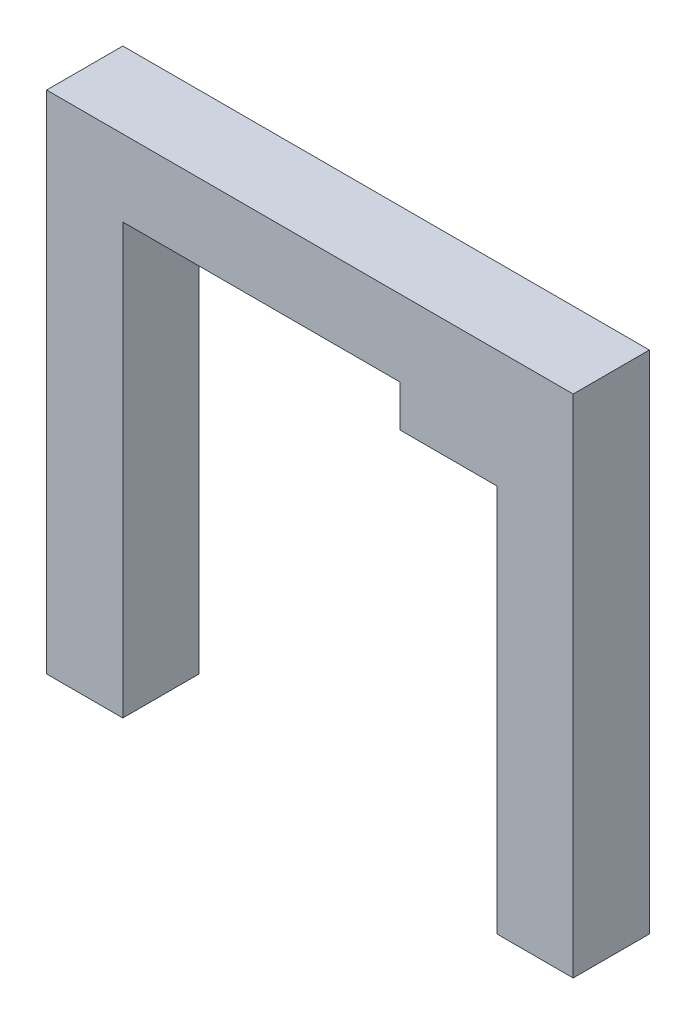
ISO-10303-21;
HEADER;
FILE_DESCRIPTION(('STEP AP214'),'2;1');
FILE_NAME('part.step','',(''),(''),'','','');
FILE_SCHEMA(('AUTOMOTIVE_DESIGN { 1 0 10303 214 1 1 1 1 }'));
ENDSEC;
DATA;
#1=APPLICATION_CONTEXT('core data for automotive mechanical design processes');
#2=APPLICATION_PROTOCOL_DEFINITION('international standard','automotive_design',2000,#1);
#3=PRODUCT_CONTEXT('',#1,'mechanical');
#4=PRODUCT('Part','Part','',(#3));
#5=PRODUCT_RELATED_PRODUCT_CATEGORY('part','',(#4));
#6=PRODUCT_DEFINITION_FORMATION('','',#4);
#7=PRODUCT_DEFINITION_CONTEXT('part definition',#1,'design');
#8=PRODUCT_DEFINITION('design','',#6,#7);
#9=PRODUCT_DEFINITION_SHAPE('','',#8);
#10=(LENGTH_UNIT() NAMED_UNIT(*) SI_UNIT(.MILLI.,.METRE.));
#11=(NAMED_UNIT(*) PLANE_ANGLE_UNIT() SI_UNIT($,.RADIAN.));
#12=(NAMED_UNIT(*) SI_UNIT($,.STERADIAN.) SOLID_ANGLE_UNIT());
#13=UNCERTAINTY_MEASURE_WITH_UNIT(LENGTH_MEASURE(1.E-05),#10,'distance_accuracy_value','');
#14=(GEOMETRIC_REPRESENTATION_CONTEXT(3) GLOBAL_UNCERTAINTY_ASSIGNED_CONTEXT((#13)) GLOBAL_UNIT_ASSIGNED_CONTEXT((#10,
#11,#12)) REPRESENTATION_CONTEXT('',''));
#15=CARTESIAN_POINT('',(0.,0.,0.));
#16=DIRECTION('',(0.,0.,1.));
#17=DIRECTION('',(1.,0.,0.));
#18=AXIS2_PLACEMENT_3D('',#15,#16,#17);
#19=CARTESIAN_POINT('',(0.,0.,5.5));
#20=DIRECTION('',(0.,1.,0.));
#21=DIRECTION('',(-1.,0.,0.));
#22=AXIS2_PLACEMENT_3D('',#19,#20,#21);
#23=PLANE('',#22);
#24=DIRECTION('',(1.,0.,0.));
#25=VECTOR('',#24,1.);
#26=CARTESIAN_POINT('',(0.,0.,0.));
#27=LINE('',#26,#25);
#28=CARTESIAN_POINT('',(-5.5,0.,0.));
#29=VERTEX_POINT('',#28);
#30=CARTESIAN_POINT('',(0.,0.,0.));
#31=VERTEX_POINT('',#30);
#32=EDGE_CURVE('E140',#29,#31,#27,.T.);
#33=ORIENTED_EDGE('',*,*,#32,.T.);
#34=DIRECTION('',(0.,0.,-1.));
#35=VECTOR('',#34,1.);
#36=CARTESIAN_POINT('',(0.,0.,5.5));
#37=LINE('',#36,#35);
#38=CARTESIAN_POINT('',(0.,0.,5.5));
#39=VERTEX_POINT('',#38);
#40=EDGE_CURVE('E11',#39,#31,#37,.T.);
#41=ORIENTED_EDGE('',*,*,#40,.F.);
#42=DIRECTION('',(1.,0.,0.));
#43=VECTOR('',#42,1.);
#44=CARTESIAN_POINT('',(0.,0.,5.5));
#45=LINE('',#44,#43);
#46=CARTESIAN_POINT('',(-5.5,0.,5.5));
#47=VERTEX_POINT('',#46);
#48=EDGE_CURVE('E158',#47,#39,#45,.T.);
#49=ORIENTED_EDGE('',*,*,#48,.F.);
#50=DIRECTION('',(0.,0.,-1.));
#51=VECTOR('',#50,1.);
#52=CARTESIAN_POINT('',(-5.5,0.,5.5));
#53=LINE('',#52,#51);
#54=EDGE_CURVE('E136',#47,#29,#53,.T.);
#55=ORIENTED_EDGE('',*,*,#54,.T.);
#56=EDGE_LOOP('',(#33,#41,#49,#55));
#57=FACE_BOUND('',#56,.T.);
#58=ADVANCED_FACE('F32',(#57),#23,.F.);
#59=CARTESIAN_POINT('',(0.,0.,5.5));
#60=DIRECTION('',(-1.,0.,0.));
#61=DIRECTION('',(0.,0.,1.));
#62=AXIS2_PLACEMENT_3D('',#59,#60,#61);
#63=PLANE('',#62);
#64=DIRECTION('',(0.,1.,0.));
#65=VECTOR('',#64,1.);
#66=CARTESIAN_POINT('',(0.,0.,0.));
#67=LINE('',#66,#65);
#68=CARTESIAN_POINT('',(0.,31.,0.));
#69=VERTEX_POINT('',#68);
#70=EDGE_CURVE('E143',#31,#69,#67,.T.);
#71=ORIENTED_EDGE('',*,*,#70,.T.);
#72=DIRECTION('',(0.,0.,-1.));
#73=VECTOR('',#72,1.);
#74=CARTESIAN_POINT('',(0.,31.,5.5));
#75=LINE('',#74,#73);
#76=CARTESIAN_POINT('',(0.,31.,5.5));
#77=VERTEX_POINT('',#76);
#78=EDGE_CURVE('E40',#77,#69,#75,.T.);
#79=ORIENTED_EDGE('',*,*,#78,.F.);
#80=DIRECTION('',(0.,1.,0.));
#81=VECTOR('',#80,1.);
#82=CARTESIAN_POINT('',(0.,0.,5.5));
#83=LINE('',#82,#81);
#84=EDGE_CURVE('E97',#39,#77,#83,.T.);
#85=ORIENTED_EDGE('',*,*,#84,.F.);
#86=ORIENTED_EDGE('',*,*,#40,.T.);
#87=EDGE_LOOP('',(#71,#79,#85,#86));
#88=FACE_BOUND('',#87,.T.);
#89=ADVANCED_FACE('F207',(#88),#63,.F.);
#90=CARTESIAN_POINT('',(20.,31.,5.5));
#91=DIRECTION('',(0.,1.,0.));
#92=DIRECTION('',(-1.,0.,0.));
#93=AXIS2_PLACEMENT_3D('',#90,#91,#92);
#94=PLANE('',#93);
#95=DIRECTION('',(1.,0.,0.));
#96=VECTOR('',#95,1.);
#97=CARTESIAN_POINT('',(20.,31.,0.));
#98=LINE('',#97,#96);
#99=CARTESIAN_POINT('',(20.,31.,0.));
#100=VERTEX_POINT('',#99);
#101=EDGE_CURVE('E145',#69,#100,#98,.T.);
#102=ORIENTED_EDGE('',*,*,#101,.T.);
#103=DIRECTION('',(0.,0.,-1.));
#104=VECTOR('',#103,1.);
#105=CARTESIAN_POINT('',(20.,31.,5.5));
#106=LINE('',#105,#104);
#107=CARTESIAN_POINT('',(20.,31.,5.5));
#108=VERTEX_POINT('',#107);
#109=EDGE_CURVE('E171',#108,#100,#106,.T.);
#110=ORIENTED_EDGE('',*,*,#109,.F.);
#111=DIRECTION('',(1.,0.,0.));
#112=VECTOR('',#111,1.);
#113=CARTESIAN_POINT('',(20.,31.,5.5));
#114=LINE('',#113,#112);
#115=EDGE_CURVE('E179',#77,#108,#114,.T.);
#116=ORIENTED_EDGE('',*,*,#115,.F.);
#117=ORIENTED_EDGE('',*,*,#78,.T.);
#118=EDGE_LOOP('',(#102,#110,#116,#117));
#119=FACE_BOUND('',#118,.T.);
#120=ADVANCED_FACE('F177',(#119),#94,.F.);
#121=CARTESIAN_POINT('',(20.,28.,5.5));
#122=DIRECTION('',(1.,0.,0.));
#123=DIRECTION('',(0.,1.,0.));
#124=AXIS2_PLACEMENT_3D('',#121,#122,#123);
#125=PLANE('',#124);
#126=DIRECTION('',(0.,-1.,0.));
#127=VECTOR('',#126,1.);
#128=CARTESIAN_POINT('',(20.,28.,0.));
#129=LINE('',#128,#127);
#130=CARTESIAN_POINT('',(20.,28.,0.));
#131=VERTEX_POINT('',#130);
#132=EDGE_CURVE('E147',#100,#131,#129,.T.);
#133=ORIENTED_EDGE('',*,*,#132,.T.);
#134=DIRECTION('',(0.,0.,-1.));
#135=VECTOR('',#134,1.);
#136=CARTESIAN_POINT('',(20.,28.,5.5));
#137=LINE('',#136,#135);
#138=CARTESIAN_POINT('',(20.,28.,5.5));
#139=VERTEX_POINT('',#138);
#140=EDGE_CURVE('E168',#139,#131,#137,.T.);
#141=ORIENTED_EDGE('',*,*,#140,.F.);
#142=DIRECTION('',(0.,-1.,0.));
#143=VECTOR('',#142,1.);
#144=CARTESIAN_POINT('',(20.,28.,5.5));
#145=LINE('',#144,#143);
#146=EDGE_CURVE('E197',#108,#139,#145,.T.);
#147=ORIENTED_EDGE('',*,*,#146,.F.);
#148=ORIENTED_EDGE('',*,*,#109,.T.);
#149=EDGE_LOOP('',(#133,#141,#147,#148));
#150=FACE_BOUND('',#149,.T.);
#151=ADVANCED_FACE('F188',(#150),#125,.F.);
#152=CARTESIAN_POINT('',(27.,28.,5.5));
#153=DIRECTION('',(0.,1.,0.));
#154=DIRECTION('',(-1.,0.,0.));
#155=AXIS2_PLACEMENT_3D('',#152,#153,#154);
#156=PLANE('',#155);
#157=DIRECTION('',(1.,0.,0.));
#158=VECTOR('',#157,1.);
#159=CARTESIAN_POINT('',(27.,28.,0.));
#160=LINE('',#159,#158);
#161=CARTESIAN_POINT('',(27.,28.,0.));
#162=VERTEX_POINT('',#161);
#163=EDGE_CURVE('E149',#131,#162,#160,.T.);
#164=ORIENTED_EDGE('',*,*,#163,.T.);
#165=DIRECTION('',(0.,0.,-1.));
#166=VECTOR('',#165,1.);
#167=CARTESIAN_POINT('',(27.,28.,5.5));
#168=LINE('',#167,#166);
#169=CARTESIAN_POINT('',(27.,28.,5.5));
#170=VERTEX_POINT('',#169);
#171=EDGE_CURVE('E165',#170,#162,#168,.T.);
#172=ORIENTED_EDGE('',*,*,#171,.F.);
#173=DIRECTION('',(1.,0.,0.));
#174=VECTOR('',#173,1.);
#175=CARTESIAN_POINT('',(27.,28.,5.5));
#176=LINE('',#175,#174);
#177=EDGE_CURVE('E194',#139,#170,#176,.T.);
#178=ORIENTED_EDGE('',*,*,#177,.F.);
#179=ORIENTED_EDGE('',*,*,#140,.T.);
#180=EDGE_LOOP('',(#164,#172,#178,#179));
#181=FACE_BOUND('',#180,.T.);
#182=ADVANCED_FACE('F192',(#181),#156,.F.);
#183=CARTESIAN_POINT('',(27.,28.,5.5));
#184=DIRECTION('',(1.,0.,0.));
#185=DIRECTION('',(0.,1.,0.));
#186=AXIS2_PLACEMENT_3D('',#183,#184,#185);
#187=PLANE('',#186);
#188=DIRECTION('',(0.,-1.,0.));
#189=VECTOR('',#188,1.);
#190=CARTESIAN_POINT('',(27.,28.,0.));
#191=LINE('',#190,#189);
#192=CARTESIAN_POINT('',(27.,0.,0.));
#193=VERTEX_POINT('',#192);
#194=EDGE_CURVE('E151',#162,#193,#191,.T.);
#195=ORIENTED_EDGE('',*,*,#194,.T.);
#196=DIRECTION('',(0.,0.,-1.));
#197=VECTOR('',#196,1.);
#198=CARTESIAN_POINT('',(27.,0.,5.5));
#199=LINE('',#198,#197);
#200=CARTESIAN_POINT('',(27.,0.,5.5));
#201=VERTEX_POINT('',#200);
#202=EDGE_CURVE('E162',#201,#193,#199,.T.);
#203=ORIENTED_EDGE('',*,*,#202,.F.);
#204=DIRECTION('',(0.,-1.,0.));
#205=VECTOR('',#204,1.);
#206=CARTESIAN_POINT('',(27.,28.,5.5));
#207=LINE('',#206,#205);
#208=EDGE_CURVE('E196',#170,#201,#207,.T.);
#209=ORIENTED_EDGE('',*,*,#208,.F.);
#210=ORIENTED_EDGE('',*,*,#171,.T.);
#211=EDGE_LOOP('',(#195,#203,#209,#210));
#212=FACE_BOUND('',#211,.T.);
#213=ADVANCED_FACE('F219',(#212),#187,.F.);
#214=CARTESIAN_POINT('',(32.5,0.,5.5));
#215=DIRECTION('',(0.,1.,0.));
#216=DIRECTION('',(-1.,0.,0.));
#217=AXIS2_PLACEMENT_3D('',#214,#215,#216);
#218=PLANE('',#217);
#219=DIRECTION('',(1.,0.,0.));
#220=VECTOR('',#219,1.);
#221=CARTESIAN_POINT('',(32.5,0.,0.));
#222=LINE('',#221,#220);
#223=CARTESIAN_POINT('',(32.5,0.,0.));
#224=VERTEX_POINT('',#223);
#225=EDGE_CURVE('E153',#193,#224,#222,.T.);
#226=ORIENTED_EDGE('',*,*,#225,.T.);
#227=DIRECTION('',(0.,0.,-1.));
#228=VECTOR('',#227,1.);
#229=CARTESIAN_POINT('',(32.5,0.,5.5));
#230=LINE('',#229,#228);
#231=CARTESIAN_POINT('',(32.5,0.,5.5));
#232=VERTEX_POINT('',#231);
#233=EDGE_CURVE('E131',#232,#224,#230,.T.);
#234=ORIENTED_EDGE('',*,*,#233,.F.);
#235=DIRECTION('',(1.,0.,0.));
#236=VECTOR('',#235,1.);
#237=CARTESIAN_POINT('',(32.5,0.,5.5));
#238=LINE('',#237,#236);
#239=EDGE_CURVE('E122',#201,#232,#238,.T.);
#240=ORIENTED_EDGE('',*,*,#239,.F.);
#241=ORIENTED_EDGE('',*,*,#202,.T.);
#242=EDGE_LOOP('',(#226,#234,#240,#241));
#243=FACE_BOUND('',#242,.T.);
#244=ADVANCED_FACE('F222',(#243),#218,.F.);
#245=CARTESIAN_POINT('',(32.5,36.5,5.5));
#246=DIRECTION('',(-1.,0.,0.));
#247=DIRECTION('',(0.,-1.,0.));
#248=AXIS2_PLACEMENT_3D('',#245,#246,#247);
#249=PLANE('',#248);
#250=DIRECTION('',(0.,1.,0.));
#251=VECTOR('',#250,1.);
#252=CARTESIAN_POINT('',(32.5,36.5,0.));
#253=LINE('',#252,#251);
#254=CARTESIAN_POINT('',(32.5,36.5,0.));
#255=VERTEX_POINT('',#254);
#256=EDGE_CURVE('E130',#224,#255,#253,.T.);
#257=ORIENTED_EDGE('',*,*,#256,.T.);
#258=DIRECTION('',(0.,0.,-1.));
#259=VECTOR('',#258,1.);
#260=CARTESIAN_POINT('',(32.5,36.5,5.5));
#261=LINE('',#260,#259);
#262=CARTESIAN_POINT('',(32.5,36.5,5.5));
#263=VERTEX_POINT('',#262);
#264=EDGE_CURVE('E127',#263,#255,#261,.T.);
#265=ORIENTED_EDGE('',*,*,#264,.F.);
#266=DIRECTION('',(0.,1.,0.));
#267=VECTOR('',#266,1.);
#268=CARTESIAN_POINT('',(32.5,36.5,5.5));
#269=LINE('',#268,#267);
#270=EDGE_CURVE('E116',#232,#263,#269,.T.);
#271=ORIENTED_EDGE('',*,*,#270,.F.);
#272=ORIENTED_EDGE('',*,*,#233,.T.);
#273=EDGE_LOOP('',(#257,#265,#271,#272));
#274=FACE_BOUND('',#273,.T.);
#275=ADVANCED_FACE('F128',(#274),#249,.F.);
#276=CARTESIAN_POINT('',(-5.5,36.5,5.5));
#277=DIRECTION('',(0.,-1.,0.));
#278=DIRECTION('',(0.,0.,-1.));
#279=AXIS2_PLACEMENT_3D('',#276,#277,#278);
#280=PLANE('',#279);
#281=DIRECTION('',(-1.,0.,0.));
#282=VECTOR('',#281,1.);
#283=CARTESIAN_POINT('',(-5.5,36.5,0.));
#284=LINE('',#283,#282);
#285=CARTESIAN_POINT('',(-5.5,36.5,0.));
#286=VERTEX_POINT('',#285);
#287=EDGE_CURVE('E83',#255,#286,#284,.T.);
#288=ORIENTED_EDGE('',*,*,#287,.T.);
#289=DIRECTION('',(0.,0.,-1.));
#290=VECTOR('',#289,1.);
#291=CARTESIAN_POINT('',(-5.5,36.5,5.5));
#292=LINE('',#291,#290);
#293=CARTESIAN_POINT('',(-5.5,36.5,5.5));
#294=VERTEX_POINT('',#293);
#295=EDGE_CURVE('E132',#294,#286,#292,.T.);
#296=ORIENTED_EDGE('',*,*,#295,.F.);
#297=DIRECTION('',(-1.,0.,0.));
#298=VECTOR('',#297,1.);
#299=CARTESIAN_POINT('',(-5.5,36.5,5.5));
#300=LINE('',#299,#298);
#301=EDGE_CURVE('E120',#263,#294,#300,.T.);
#302=ORIENTED_EDGE('',*,*,#301,.F.);
#303=ORIENTED_EDGE('',*,*,#264,.T.);
#304=EDGE_LOOP('',(#288,#296,#302,#303));
#305=FACE_BOUND('',#304,.T.);
#306=ADVANCED_FACE('F134',(#305),#280,.F.);
#307=CARTESIAN_POINT('',(-5.5,0.,5.5));
#308=DIRECTION('',(1.,0.,0.));
#309=DIRECTION('',(0.,0.,-1.));
#310=AXIS2_PLACEMENT_3D('',#307,#308,#309);
#311=PLANE('',#310);
#312=DIRECTION('',(0.,-1.,0.));
#313=VECTOR('',#312,1.);
#314=CARTESIAN_POINT('',(-5.5,0.,0.));
#315=LINE('',#314,#313);
#316=EDGE_CURVE('E89',#286,#29,#315,.T.);
#317=ORIENTED_EDGE('',*,*,#316,.T.);
#318=ORIENTED_EDGE('',*,*,#54,.F.);
#319=DIRECTION('',(0.,-1.,0.));
#320=VECTOR('',#319,1.);
#321=CARTESIAN_POINT('',(-5.5,0.,5.5));
#322=LINE('',#321,#320);
#323=EDGE_CURVE('E48',#294,#47,#322,.T.);
#324=ORIENTED_EDGE('',*,*,#323,.F.);
#325=ORIENTED_EDGE('',*,*,#295,.T.);
#326=EDGE_LOOP('',(#317,#318,#324,#325));
#327=FACE_BOUND('',#326,.T.);
#328=ADVANCED_FACE('F231',(#327),#311,.F.);
#329=CARTESIAN_POINT('',(0.,0.,5.5));
#330=DIRECTION('',(0.,0.,-1.));
#331=DIRECTION('',(-1.,0.,0.));
#332=AXIS2_PLACEMENT_3D('',#329,#330,#331);
#333=PLANE('',#332);
#334=ORIENTED_EDGE('',*,*,#48,.T.);
#335=ORIENTED_EDGE('',*,*,#84,.T.);
#336=ORIENTED_EDGE('',*,*,#115,.T.);
#337=ORIENTED_EDGE('',*,*,#146,.T.);
#338=ORIENTED_EDGE('',*,*,#177,.T.);
#339=ORIENTED_EDGE('',*,*,#208,.T.);
#340=ORIENTED_EDGE('',*,*,#239,.T.);
#341=ORIENTED_EDGE('',*,*,#270,.T.);
#342=ORIENTED_EDGE('',*,*,#301,.T.);
#343=ORIENTED_EDGE('',*,*,#323,.T.);
#344=EDGE_LOOP('',(#334,#335,#336,#337,#338,#339,#340,#341,#342,#343));
#345=FACE_BOUND('',#344,.T.);
#346=ADVANCED_FACE('F118',(#345),#333,.F.);
#347=CARTESIAN_POINT('',(0.,0.,0.));
#348=DIRECTION('',(0.,0.,-1.));
#349=DIRECTION('',(-1.,0.,0.));
#350=AXIS2_PLACEMENT_3D('',#347,#348,#349);
#351=PLANE('',#350);
#352=ORIENTED_EDGE('',*,*,#32,.F.);
#353=ORIENTED_EDGE('',*,*,#316,.F.);
#354=ORIENTED_EDGE('',*,*,#287,.F.);
#355=ORIENTED_EDGE('',*,*,#256,.F.);
#356=ORIENTED_EDGE('',*,*,#225,.F.);
#357=ORIENTED_EDGE('',*,*,#194,.F.);
#358=ORIENTED_EDGE('',*,*,#163,.F.);
#359=ORIENTED_EDGE('',*,*,#132,.F.);
#360=ORIENTED_EDGE('',*,*,#101,.F.);
#361=ORIENTED_EDGE('',*,*,#70,.F.);
#362=EDGE_LOOP('',(#352,#353,#354,#355,#356,#357,#358,#359,#360,#361));
#363=FACE_BOUND('',#362,.T.);
#364=ADVANCED_FACE('F183',(#363),#351,.T.);
#365=CLOSED_SHELL('',(#58,#89,#120,#151,#182,#213,#244,#275,#306,#328,#346,#364));
#366=MANIFOLD_SOLID_BREP('B2',#365);
#367=ADVANCED_BREP_SHAPE_REPRESENTATION('',(#18,#366),#14);
#368=SHAPE_DEFINITION_REPRESENTATION(#9,#367);
ENDSEC;
END-ISO-10303-21;
